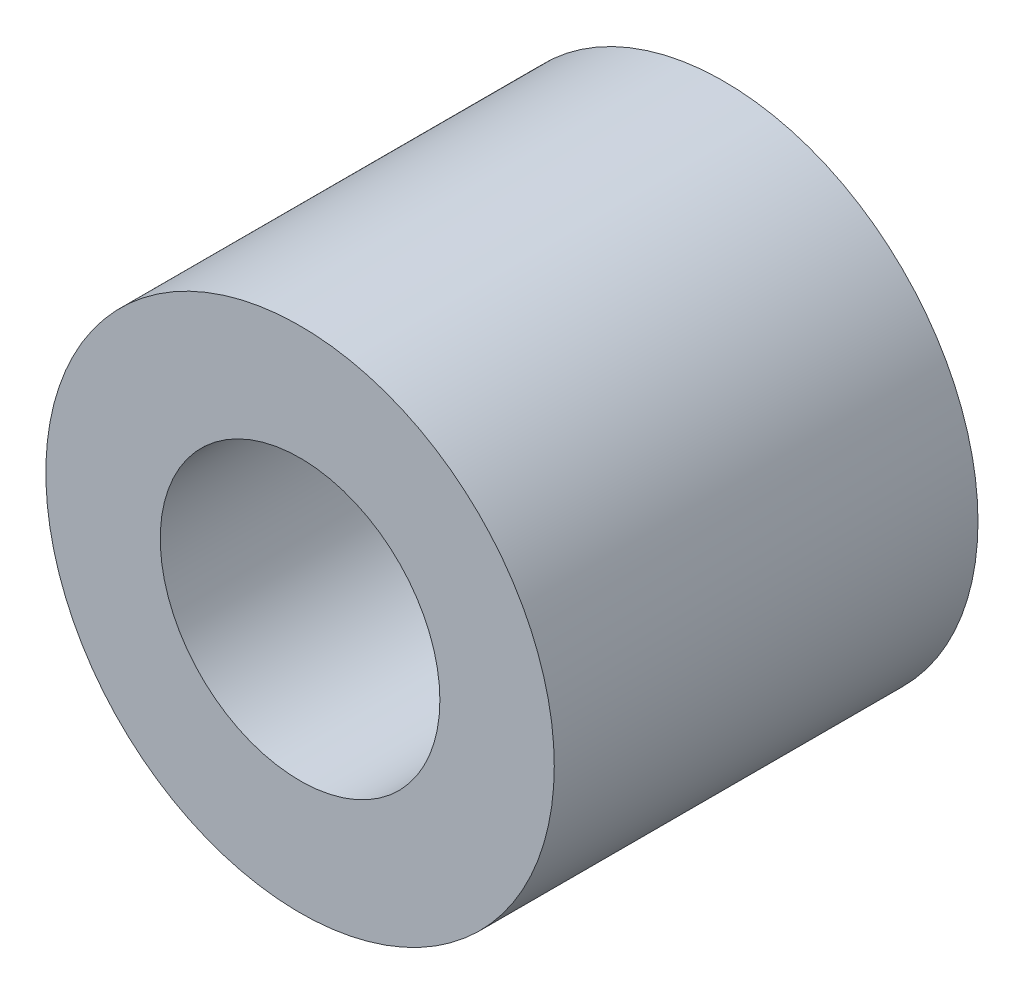
ISO-10303-21;
HEADER;
FILE_DESCRIPTION(('STEP AP214'),'2;1');
FILE_NAME('part.step','',(''),(''),'','','');
FILE_SCHEMA(('AUTOMOTIVE_DESIGN { 1 0 10303 214 1 1 1 1 }'));
ENDSEC;
DATA;
#1=APPLICATION_CONTEXT('core data for automotive mechanical design processes');
#2=APPLICATION_PROTOCOL_DEFINITION('international standard','automotive_design',2000,#1);
#3=PRODUCT_CONTEXT('',#1,'mechanical');
#4=PRODUCT('Part','Part','',(#3));
#5=PRODUCT_RELATED_PRODUCT_CATEGORY('part','',(#4));
#6=PRODUCT_DEFINITION_FORMATION('','',#4);
#7=PRODUCT_DEFINITION_CONTEXT('part definition',#1,'design');
#8=PRODUCT_DEFINITION('design','',#6,#7);
#9=PRODUCT_DEFINITION_SHAPE('','',#8);
#10=(LENGTH_UNIT() NAMED_UNIT(*) SI_UNIT(.MILLI.,.METRE.));
#11=(NAMED_UNIT(*) PLANE_ANGLE_UNIT() SI_UNIT($,.RADIAN.));
#12=(NAMED_UNIT(*) SI_UNIT($,.STERADIAN.) SOLID_ANGLE_UNIT());
#13=UNCERTAINTY_MEASURE_WITH_UNIT(LENGTH_MEASURE(1.E-05),#10,'distance_accuracy_value','');
#14=(GEOMETRIC_REPRESENTATION_CONTEXT(3) GLOBAL_UNCERTAINTY_ASSIGNED_CONTEXT((#13)) GLOBAL_UNIT_ASSIGNED_CONTEXT((#10,
#11,#12)) REPRESENTATION_CONTEXT('',''));
#15=CARTESIAN_POINT('',(0.,0.,0.));
#16=DIRECTION('',(0.,0.,1.));
#17=DIRECTION('',(1.,0.,0.));
#18=AXIS2_PLACEMENT_3D('',#15,#16,#17);
#19=CARTESIAN_POINT('',(0.,0.,5.));
#20=DIRECTION('',(0.,0.,1.));
#21=DIRECTION('',(1.,0.,0.));
#22=AXIS2_PLACEMENT_3D('',#19,#20,#21);
#23=PLANE('',#22);
#24=CARTESIAN_POINT('',(0.,0.,5.));
#25=DIRECTION('',(0.,0.,1.));
#26=DIRECTION('',(1.,0.,0.));
#27=AXIS2_PLACEMENT_3D('',#24,#25,#26);
#28=CIRCLE('',#27,3.);
#29=CARTESIAN_POINT('',(3.,0.,5.));
#30=VERTEX_POINT('',#29);
#31=EDGE_CURVE('E10',#30,#30,#28,.T.);
#32=ORIENTED_EDGE('',*,*,#31,.T.);
#33=EDGE_LOOP('',(#32));
#34=FACE_BOUND('',#33,.T.);
#35=CARTESIAN_POINT('',(0.,0.,5.));
#36=DIRECTION('',(0.,0.,1.));
#37=DIRECTION('',(1.,0.,0.));
#38=AXIS2_PLACEMENT_3D('',#35,#36,#37);
#39=CIRCLE('',#38,1.65);
#40=CARTESIAN_POINT('',(1.65,0.,5.));
#41=VERTEX_POINT('',#40);
#42=EDGE_CURVE('E44',#41,#41,#39,.T.);
#43=ORIENTED_EDGE('',*,*,#42,.F.);
#44=EDGE_LOOP('',(#43));
#45=FACE_BOUND('',#44,.T.);
#46=ADVANCED_FACE('F33',(#34,#45),#23,.T.);
#47=CARTESIAN_POINT('',(0.,0.,0.));
#48=DIRECTION('',(0.,0.,1.));
#49=DIRECTION('',(1.,0.,0.));
#50=AXIS2_PLACEMENT_3D('',#47,#48,#49);
#51=PLANE('',#50);
#52=CARTESIAN_POINT('',(0.,0.,0.));
#53=DIRECTION('',(0.,0.,1.));
#54=DIRECTION('',(1.,0.,0.));
#55=AXIS2_PLACEMENT_3D('',#52,#53,#54);
#56=CIRCLE('',#55,3.);
#57=CARTESIAN_POINT('',(3.,0.,0.));
#58=VERTEX_POINT('',#57);
#59=EDGE_CURVE('E37',#58,#58,#56,.T.);
#60=ORIENTED_EDGE('',*,*,#59,.F.);
#61=EDGE_LOOP('',(#60));
#62=FACE_BOUND('',#61,.T.);
#63=CARTESIAN_POINT('',(0.,0.,0.));
#64=DIRECTION('',(0.,0.,1.));
#65=DIRECTION('',(1.,0.,0.));
#66=AXIS2_PLACEMENT_3D('',#63,#64,#65);
#67=CIRCLE('',#66,1.65);
#68=CARTESIAN_POINT('',(1.65,0.,0.));
#69=VERTEX_POINT('',#68);
#70=EDGE_CURVE('E46',#69,#69,#67,.T.);
#71=ORIENTED_EDGE('',*,*,#70,.T.);
#72=EDGE_LOOP('',(#71));
#73=FACE_BOUND('',#72,.T.);
#74=ADVANCED_FACE('F56',(#62,#73),#51,.F.);
#75=CARTESIAN_POINT('',(0.,0.,5.));
#76=DIRECTION('',(0.,0.,-1.));
#77=DIRECTION('',(-1.,0.,0.));
#78=AXIS2_PLACEMENT_3D('',#75,#76,#77);
#79=CYLINDRICAL_SURFACE('',#78,3.);
#80=ORIENTED_EDGE('',*,*,#31,.F.);
#81=EDGE_LOOP('',(#80));
#82=FACE_BOUND('',#81,.T.);
#83=ORIENTED_EDGE('',*,*,#59,.T.);
#84=EDGE_LOOP('',(#83));
#85=FACE_BOUND('',#84,.T.);
#86=ADVANCED_FACE('F35',(#82,#85),#79,.T.);
#87=CARTESIAN_POINT('',(0.,0.,5.));
#88=DIRECTION('',(0.,0.,-1.));
#89=DIRECTION('',(-1.,0.,0.));
#90=AXIS2_PLACEMENT_3D('',#87,#88,#89);
#91=CYLINDRICAL_SURFACE('',#90,1.65);
#92=ORIENTED_EDGE('',*,*,#42,.T.);
#93=EDGE_LOOP('',(#92));
#94=FACE_BOUND('',#93,.T.);
#95=ORIENTED_EDGE('',*,*,#70,.F.);
#96=EDGE_LOOP('',(#95));
#97=FACE_BOUND('',#96,.T.);
#98=ADVANCED_FACE('F52',(#94,#97),#91,.F.);
#99=CLOSED_SHELL('',(#46,#74,#86,#98));
#100=MANIFOLD_SOLID_BREP('B2',#99);
#101=ADVANCED_BREP_SHAPE_REPRESENTATION('',(#18,#100),#14);
#102=SHAPE_DEFINITION_REPRESENTATION(#9,#101);
ENDSEC;
END-ISO-10303-21;
